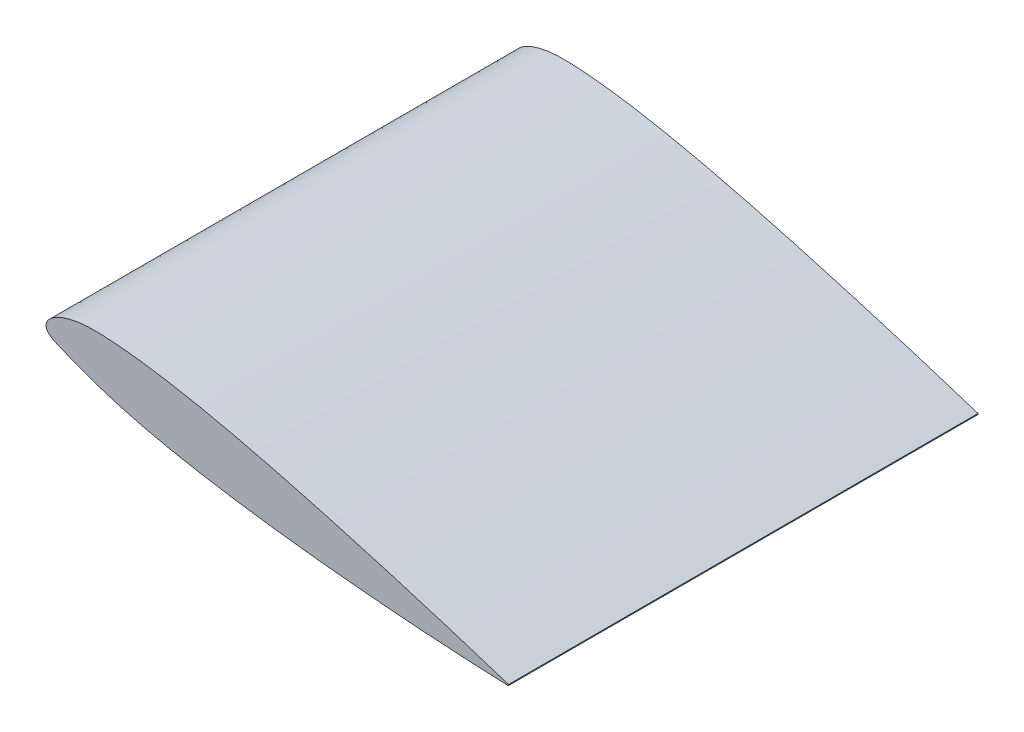
ISO-10303-21;
HEADER;
FILE_DESCRIPTION(('STEP AP214'),'2;1');
FILE_NAME('part.step','',(''),(''),'','','');
FILE_SCHEMA(('AUTOMOTIVE_DESIGN { 1 0 10303 214 1 1 1 1 }'));
ENDSEC;
DATA;
#1=APPLICATION_CONTEXT('core data for automotive mechanical design processes');
#2=APPLICATION_PROTOCOL_DEFINITION('international standard','automotive_design',2000,#1);
#3=PRODUCT_CONTEXT('',#1,'mechanical');
#4=PRODUCT('Part','Part','',(#3));
#5=PRODUCT_RELATED_PRODUCT_CATEGORY('part','',(#4));
#6=PRODUCT_DEFINITION_FORMATION('','',#4);
#7=PRODUCT_DEFINITION_CONTEXT('part definition',#1,'design');
#8=PRODUCT_DEFINITION('design','',#6,#7);
#9=PRODUCT_DEFINITION_SHAPE('','',#8);
#10=(LENGTH_UNIT() NAMED_UNIT(*) SI_UNIT(.MILLI.,.METRE.));
#11=(NAMED_UNIT(*) PLANE_ANGLE_UNIT() SI_UNIT($,.RADIAN.));
#12=(NAMED_UNIT(*) SI_UNIT($,.STERADIAN.) SOLID_ANGLE_UNIT());
#13=UNCERTAINTY_MEASURE_WITH_UNIT(LENGTH_MEASURE(1.E-05),#10,'distance_accuracy_value','');
#14=(GEOMETRIC_REPRESENTATION_CONTEXT(3) GLOBAL_UNCERTAINTY_ASSIGNED_CONTEXT((#13)) GLOBAL_UNIT_ASSIGNED_CONTEXT((#10,
#11,#12)) REPRESENTATION_CONTEXT('',''));
#15=CARTESIAN_POINT('',(0.,0.,0.));
#16=DIRECTION('',(0.,0.,1.));
#17=DIRECTION('',(1.,0.,0.));
#18=AXIS2_PLACEMENT_3D('',#15,#16,#17);
#19=CARTESIAN_POINT('',(492.514532323157,-86.2046043050554,500.));
#20=CARTESIAN_POINT('',(469.15248302354,-78.5835593889276,500.));
#21=CARTESIAN_POINT('',(429.191484222208,-65.9554552514842,500.));
#22=CARTESIAN_POINT('',(373.797941733095,-49.2132400775571,500.));
#23=CARTESIAN_POINT('',(325.443584595456,-35.1386536348898,500.));
#24=CARTESIAN_POINT('',(281.023077324573,-22.791525731888,500.));
#25=CARTESIAN_POINT('',(239.326810576857,-11.8733097386325,500.));
#26=CARTESIAN_POINT('',(201.862573325477,-2.74759552966872,500.));
#27=CARTESIAN_POINT('',(169.200176624908,4.43198713000977,500.));
#28=CARTESIAN_POINT('',(141.682179262135,9.77108188924473,500.));
#29=CARTESIAN_POINT('',(119.43355009881,13.5526670400953,500.));
#30=CARTESIAN_POINT('',(101.677310230356,16.0713558660155,500.));
#31=CARTESIAN_POINT('',(88.2073325833561,17.6390223869884,500.));
#32=CARTESIAN_POINT('',(78.7302509492452,18.5717772096362,500.));
#33=CARTESIAN_POINT('',(69.6252565486762,19.2804457309743,500.));
#34=CARTESIAN_POINT('',(60.8216211766069,19.795263902989,500.));
#35=CARTESIAN_POINT('',(52.2732008129142,20.0028795972125,500.));
#36=CARTESIAN_POINT('',(44.0474615682229,19.8019801179193,500.));
#37=CARTESIAN_POINT('',(36.2689484278879,19.1369692608639,500.));
#38=CARTESIAN_POINT('',(29.0564065147527,17.997313874278,500.));
#39=CARTESIAN_POINT('',(22.515698027998,16.4145985624629,500.));
#40=CARTESIAN_POINT('',(16.7329407728188,14.4536827174694,500.));
#41=CARTESIAN_POINT('',(11.7697996754098,12.2009874848386,500.));
#42=CARTESIAN_POINT('',(7.66192841381599,9.75139839969133,500.));
#43=CARTESIAN_POINT('',(4.42046846227789,7.19532444850889,500.));
#44=CARTESIAN_POINT('',(2.03701590055766,4.60634620465106,500.));
#45=CARTESIAN_POINT('',(0.493738145022686,2.03135848232174,500.));
#46=CARTESIAN_POINT('',(-0.210133755083993,-0.508697617913651,500.));
#47=CARTESIAN_POINT('',(-0.0581493664935866,-2.94655582477486,500.));
#48=CARTESIAN_POINT('',(0.868989261441434,-5.18581794077744,500.));
#49=CARTESIAN_POINT('',(2.47533168819947,-7.18104190555009,500.));
#50=CARTESIAN_POINT('',(4.65585418913933,-8.97341486322925,500.));
#51=CARTESIAN_POINT('',(7.35309619599559,-10.6349980919105,500.));
#52=CARTESIAN_POINT('',(10.5238840666239,-12.2283468423831,500.));
#53=CARTESIAN_POINT('',(14.1325898762527,-13.8104331456536,500.));
#54=CARTESIAN_POINT('',(18.1550018028453,-15.4332622258111,500.));
#55=CARTESIAN_POINT('',(22.5842016788422,-17.1435561346564,500.));
#56=CARTESIAN_POINT('',(27.4349975743826,-18.9819867500995,500.));
#57=CARTESIAN_POINT('',(34.8756101366174,-21.7848252000455,500.));
#58=CARTESIAN_POINT('',(43.0608069054968,-24.8537185148886,500.));
#59=CARTESIAN_POINT('',(52.1233417649803,-28.136676914937,500.));
#60=CARTESIAN_POINT('',(59.9862991087577,-30.8442682517339,500.));
#61=CARTESIAN_POINT('',(75.0178011238853,-35.6124998980717,500.));
#62=CARTESIAN_POINT('',(94.6071500783516,-40.9770858490912,500.));
#63=CARTESIAN_POINT('',(122.92377416927,-47.6187561180115,500.));
#64=CARTESIAN_POINT('',(153.964968390633,-53.8418135387777,500.));
#65=CARTESIAN_POINT('',(190.761311956723,-60.0599050034201,500.));
#66=CARTESIAN_POINT('',(228.985634296299,-65.5651103190455,500.));
#67=CARTESIAN_POINT('',(271.835199275688,-70.8846973031805,500.));
#68=CARTESIAN_POINT('',(317.771503668871,-75.7294743815895,500.));
#69=CARTESIAN_POINT('',(368.025663903744,-80.1796276776615,500.));
#70=CARTESIAN_POINT('',(420.250946058042,-83.9719024782961,500.));
#71=CARTESIAN_POINT('',(461.68383957338,-86.2293285129515,500.));
#72=CARTESIAN_POINT('',(486.256197530457,-87.2211563603204,500.));
#73=CARTESIAN_POINT('',(491.834044293514,-87.4268923834771,500.));
#74=CARTESIAN_POINT('',(492.294218438101,-87.4437492919525,500.));
#75=B_SPLINE_CURVE_WITH_KNOTS('',3,(#19,#20,#21,#22,#23,#24,#25,#26,#27,#28,#29,#30,#31,#32,#33,
#34,#35,#36,#37,#38,#39,#40,#41,#42,#43,#44,#45,#46,#47,#48,#49,#50,#51,#52,#53,#54,#55,#56,#57,
#58,#59,#60,#61,#62,#63,#64,#65,#66,#67,#68,#69,#70,#71,#72,#73,#74),.UNSPECIFIED.,.F.,.F.,(4,1,
1,1,1,1,1,1,1,1,1,1,1,1,1,1,1,1,1,1,1,1,1,1,1,1,1,1,1,1,1,1,1,1,1,1,1,1,1,1,1,1,1,1,1,1,1,1,1,1,
1,1,1,4),(0.,0.0722550253734794,0.123222088761853,0.170150757534148,0.220331601096186,
0.258781731104678,0.296881738246017,0.333704420461419,0.357104545178893,0.379297669118749,
0.40005543887892,0.409830086831331,0.419169499167558,0.428054093326848,0.436681352682776,
0.445096794601016,0.453189549236812,0.460862874749271,0.468034876100685,0.474639206250323,
0.480625941266989,0.485962658145206,0.490636119254039,0.494655604614058,0.498059761278414,
0.50092918338785,0.503404007348017,0.505690992948918,0.507976561709757,0.510416375078924,
0.513147823691988,0.516239072626078,0.519713615065657,0.523574449703375,0.527821966402288,
0.532466294460743,0.537534821509066,0.543074938596254,0.555844990792284,0.563237838565225,
0.571415938770629,0.580295189374215,0.609601939120403,0.631115834363691,0.665807087469062,
0.702674524037023,0.740833418823869,0.779352204097302,0.829629038329676,0.876644639683574,
0.927690479686737,0.983588069282549,0.998646022995485,1.),.UNSPECIFIED.);
#76=DIRECTION('',(0.,0.,-1.));
#77=VECTOR('',#76,1.);
#78=SURFACE_OF_LINEAR_EXTRUSION('',#75,#77);
#79=CARTESIAN_POINT('',(492.514532323157,-86.2046043050554,0.));
#80=CARTESIAN_POINT('',(469.15248302354,-78.5835593889276,0.));
#81=CARTESIAN_POINT('',(429.191484222208,-65.9554552514842,0.));
#82=CARTESIAN_POINT('',(373.797941733095,-49.2132400775571,0.));
#83=CARTESIAN_POINT('',(325.443584595456,-35.1386536348898,0.));
#84=CARTESIAN_POINT('',(281.023077324573,-22.791525731888,0.));
#85=CARTESIAN_POINT('',(239.326810576857,-11.8733097386325,0.));
#86=CARTESIAN_POINT('',(201.862573325477,-2.74759552966872,0.));
#87=CARTESIAN_POINT('',(169.200176624908,4.43198713000977,0.));
#88=CARTESIAN_POINT('',(141.682179262135,9.77108188924473,0.));
#89=CARTESIAN_POINT('',(119.43355009881,13.5526670400953,0.));
#90=CARTESIAN_POINT('',(101.677310230356,16.0713558660155,0.));
#91=CARTESIAN_POINT('',(88.2073325833561,17.6390223869884,0.));
#92=CARTESIAN_POINT('',(78.7302509492452,18.5717772096362,0.));
#93=CARTESIAN_POINT('',(69.6252565486762,19.2804457309743,0.));
#94=CARTESIAN_POINT('',(60.8216211766069,19.795263902989,0.));
#95=CARTESIAN_POINT('',(52.2732008129142,20.0028795972125,0.));
#96=CARTESIAN_POINT('',(44.0474615682229,19.8019801179193,0.));
#97=CARTESIAN_POINT('',(36.2689484278879,19.1369692608639,0.));
#98=CARTESIAN_POINT('',(29.0564065147527,17.997313874278,0.));
#99=CARTESIAN_POINT('',(22.515698027998,16.4145985624629,0.));
#100=CARTESIAN_POINT('',(16.7329407728188,14.4536827174694,0.));
#101=CARTESIAN_POINT('',(11.7697996754098,12.2009874848386,0.));
#102=CARTESIAN_POINT('',(7.66192841381599,9.75139839969133,0.));
#103=CARTESIAN_POINT('',(4.42046846227789,7.19532444850889,0.));
#104=CARTESIAN_POINT('',(2.03701590055766,4.60634620465106,0.));
#105=CARTESIAN_POINT('',(0.493738145022686,2.03135848232174,0.));
#106=CARTESIAN_POINT('',(-0.210133755083993,-0.508697617913651,0.));
#107=CARTESIAN_POINT('',(-0.0581493664935866,-2.94655582477486,0.));
#108=CARTESIAN_POINT('',(0.868989261441434,-5.18581794077744,0.));
#109=CARTESIAN_POINT('',(2.47533168819947,-7.18104190555009,0.));
#110=CARTESIAN_POINT('',(4.65585418913933,-8.97341486322925,0.));
#111=CARTESIAN_POINT('',(7.35309619599559,-10.6349980919105,0.));
#112=CARTESIAN_POINT('',(10.5238840666239,-12.2283468423831,0.));
#113=CARTESIAN_POINT('',(14.1325898762527,-13.8104331456536,0.));
#114=CARTESIAN_POINT('',(18.1550018028453,-15.4332622258111,0.));
#115=CARTESIAN_POINT('',(22.5842016788422,-17.1435561346564,0.));
#116=CARTESIAN_POINT('',(27.4349975743826,-18.9819867500995,0.));
#117=CARTESIAN_POINT('',(34.8756101366174,-21.7848252000455,0.));
#118=CARTESIAN_POINT('',(43.0608069054968,-24.8537185148886,0.));
#119=CARTESIAN_POINT('',(52.1233417649803,-28.136676914937,0.));
#120=CARTESIAN_POINT('',(59.9862991087577,-30.8442682517339,0.));
#121=CARTESIAN_POINT('',(75.0178011238853,-35.6124998980717,0.));
#122=CARTESIAN_POINT('',(94.6071500783516,-40.9770858490912,0.));
#123=CARTESIAN_POINT('',(122.92377416927,-47.6187561180115,0.));
#124=CARTESIAN_POINT('',(153.964968390633,-53.8418135387777,0.));
#125=CARTESIAN_POINT('',(190.761311956723,-60.0599050034201,0.));
#126=CARTESIAN_POINT('',(228.985634296299,-65.5651103190455,0.));
#127=CARTESIAN_POINT('',(271.835199275688,-70.8846973031805,0.));
#128=CARTESIAN_POINT('',(317.771503668871,-75.7294743815895,0.));
#129=CARTESIAN_POINT('',(368.025663903744,-80.1796276776615,0.));
#130=CARTESIAN_POINT('',(420.250946058042,-83.9719024782961,0.));
#131=CARTESIAN_POINT('',(461.68383957338,-86.2293285129515,0.));
#132=CARTESIAN_POINT('',(486.256197530457,-87.2211563603204,0.));
#133=CARTESIAN_POINT('',(491.834044293514,-87.4268923834771,0.));
#134=CARTESIAN_POINT('',(492.294218438101,-87.4437492919525,0.));
#135=B_SPLINE_CURVE_WITH_KNOTS('',3,(#79,#80,#81,#82,#83,#84,#85,#86,#87,#88,#89,#90,#91,#92,
#93,#94,#95,#96,#97,#98,#99,#100,#101,#102,#103,#104,#105,#106,#107,#108,#109,#110,#111,#112,
#113,#114,#115,#116,#117,#118,#119,#120,#121,#122,#123,#124,#125,#126,#127,#128,#129,#130,#131,
#132,#133,#134),.UNSPECIFIED.,.F.,.F.,(4,1,1,1,1,1,1,1,1,1,1,1,1,1,1,1,1,1,1,1,1,1,1,1,1,1,1,1,
1,1,1,1,1,1,1,1,1,1,1,1,1,1,1,1,1,1,1,1,1,1,1,1,1,4),(0.,0.0722550253734794,0.123222088761853,
0.170150757534148,0.220331601096186,0.258781731104678,0.296881738246017,0.333704420461419,
0.357104545178893,0.379297669118749,0.40005543887892,0.409830086831331,0.419169499167558,
0.428054093326848,0.436681352682776,0.445096794601016,0.453189549236812,0.460862874749271,
0.468034876100685,0.474639206250323,0.480625941266989,0.485962658145206,0.490636119254039,
0.494655604614058,0.498059761278414,0.50092918338785,0.503404007348017,0.505690992948918,
0.507976561709757,0.510416375078924,0.513147823691988,0.516239072626078,0.519713615065657,
0.523574449703375,0.527821966402288,0.532466294460743,0.537534821509066,0.543074938596254,
0.555844990792284,0.563237838565225,0.571415938770629,0.580295189374215,0.609601939120403,
0.631115834363691,0.665807087469062,0.702674524037023,0.740833418823869,0.779352204097302,
0.829629038329676,0.876644639683574,0.927690479686737,0.983588069282549,0.998646022995485,1.),.UNSPECIFIED.);
#136=CARTESIAN_POINT('',(492.514532323156,-86.2046043050553,0.));
#137=VERTEX_POINT('',#136);
#138=CARTESIAN_POINT('',(492.2942184381,-87.4437492919524,0.));
#139=VERTEX_POINT('',#138);
#140=EDGE_CURVE('E68',#137,#139,#135,.T.);
#141=ORIENTED_EDGE('',*,*,#140,.T.);
#142=DIRECTION('',(0.,0.,-1.));
#143=VECTOR('',#142,1.);
#144=CARTESIAN_POINT('',(492.2942184381,-87.4437492919524,500.));
#145=LINE('',#144,#143);
#146=CARTESIAN_POINT('',(492.2942184381,-87.4437492919524,500.));
#147=VERTEX_POINT('',#146);
#148=EDGE_CURVE('E11',#147,#139,#145,.T.);
#149=ORIENTED_EDGE('',*,*,#148,.F.);
#150=CARTESIAN_POINT('',(492.514532323156,-86.2046043050553,500.));
#151=VERTEX_POINT('',#150);
#152=EDGE_CURVE('E70',#151,#147,#75,.T.);
#153=ORIENTED_EDGE('',*,*,#152,.F.);
#154=DIRECTION('',(0.,0.,-1.));
#155=VECTOR('',#154,1.);
#156=CARTESIAN_POINT('',(492.514532323156,-86.2046043050553,500.));
#157=LINE('',#156,#155);
#158=EDGE_CURVE('E52',#151,#137,#157,.T.);
#159=ORIENTED_EDGE('',*,*,#158,.T.);
#160=EDGE_LOOP('',(#141,#149,#153,#159));
#161=FACE_BOUND('',#160,.T.);
#162=ADVANCED_FACE('F43',(#161),#78,.F.);
#163=CARTESIAN_POINT('',(492.514532323156,-86.2046043050553,500.));
#164=DIRECTION('',(0.984559571564675,-0.175049850158129,0.));
#165=DIRECTION('',(0.175049850158129,0.984559571564675,0.));
#166=AXIS2_PLACEMENT_3D('',#163,#164,#165);
#167=PLANE('',#166);
#168=DIRECTION('',(-0.175049850158129,-0.984559571564675,0.));
#169=VECTOR('',#168,1.);
#170=CARTESIAN_POINT('',(492.514532323156,-86.2046043050553,0.));
#171=LINE('',#170,#169);
#172=EDGE_CURVE('E75',#137,#139,#171,.T.);
#173=ORIENTED_EDGE('',*,*,#172,.F.);
#174=ORIENTED_EDGE('',*,*,#158,.F.);
#175=DIRECTION('',(-0.175049850158129,-0.984559571564675,0.));
#176=VECTOR('',#175,1.);
#177=CARTESIAN_POINT('',(492.514532323156,-86.2046043050553,500.));
#178=LINE('',#177,#176);
#179=EDGE_CURVE('E72',#151,#147,#178,.T.);
#180=ORIENTED_EDGE('',*,*,#179,.T.);
#181=ORIENTED_EDGE('',*,*,#148,.T.);
#182=EDGE_LOOP('',(#173,#174,#180,#181));
#183=FACE_BOUND('',#182,.T.);
#184=ADVANCED_FACE('F77',(#183),#167,.T.);
#185=CARTESIAN_POINT('',(0.958420098701504,2.71544393435108,500.));
#186=DIRECTION('',(0.,0.,-1.));
#187=DIRECTION('',(-1.,0.,0.));
#188=AXIS2_PLACEMENT_3D('',#185,#186,#187);
#189=PLANE('',#188);
#190=ORIENTED_EDGE('',*,*,#152,.T.);
#191=ORIENTED_EDGE('',*,*,#179,.F.);
#192=EDGE_LOOP('',(#190,#191));
#193=FACE_BOUND('',#192,.T.);
#194=ADVANCED_FACE('F92',(#193),#189,.F.);
#195=CARTESIAN_POINT('',(0.958420098701504,2.71544393435108,0.));
#196=DIRECTION('',(0.,0.,-1.));
#197=DIRECTION('',(-1.,0.,0.));
#198=AXIS2_PLACEMENT_3D('',#195,#196,#197);
#199=PLANE('',#198);
#200=ORIENTED_EDGE('',*,*,#140,.F.);
#201=ORIENTED_EDGE('',*,*,#172,.T.);
#202=EDGE_LOOP('',(#200,#201));
#203=FACE_BOUND('',#202,.T.);
#204=ADVANCED_FACE('F74',(#203),#199,.T.);
#205=CLOSED_SHELL('',(#162,#184,#194,#204));
#206=MANIFOLD_SOLID_BREP('B2',#205);
#207=ADVANCED_BREP_SHAPE_REPRESENTATION('',(#18,#206),#14);
#208=SHAPE_DEFINITION_REPRESENTATION(#9,#207);
ENDSEC;
END-ISO-10303-21;
